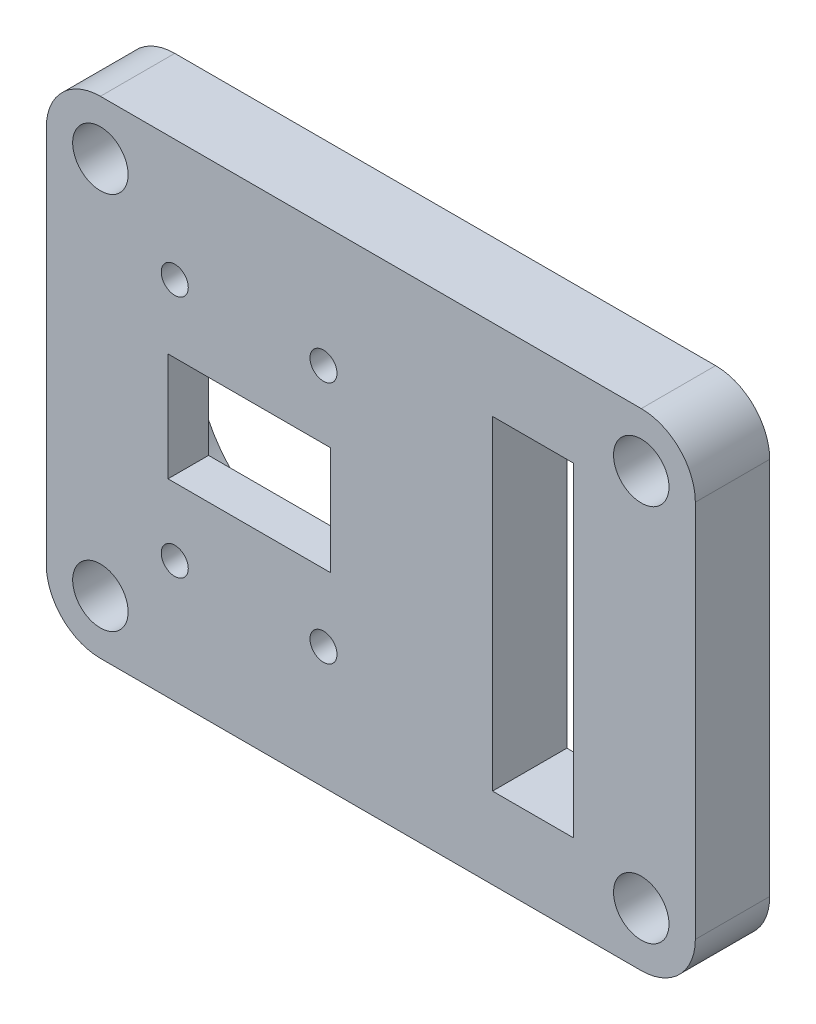
ISO-10303-21;
HEADER;
FILE_DESCRIPTION(('STEP AP214'),'2;1');
FILE_NAME('part.step','',(''),(''),'','','');
FILE_SCHEMA(('AUTOMOTIVE_DESIGN { 1 0 10303 214 1 1 1 1 }'));
ENDSEC;
DATA;
#1=APPLICATION_CONTEXT('core data for automotive mechanical design processes');
#2=APPLICATION_PROTOCOL_DEFINITION('international standard','automotive_design',2000,#1);
#3=PRODUCT_CONTEXT('',#1,'mechanical');
#4=PRODUCT('Part','Part','',(#3));
#5=PRODUCT_RELATED_PRODUCT_CATEGORY('part','',(#4));
#6=PRODUCT_DEFINITION_FORMATION('','',#4);
#7=PRODUCT_DEFINITION_CONTEXT('part definition',#1,'design');
#8=PRODUCT_DEFINITION('design','',#6,#7);
#9=PRODUCT_DEFINITION_SHAPE('','',#8);
#10=(LENGTH_UNIT() NAMED_UNIT(*) SI_UNIT(.MILLI.,.METRE.));
#11=(NAMED_UNIT(*) PLANE_ANGLE_UNIT() SI_UNIT($,.RADIAN.));
#12=(NAMED_UNIT(*) SI_UNIT($,.STERADIAN.) SOLID_ANGLE_UNIT());
#13=UNCERTAINTY_MEASURE_WITH_UNIT(LENGTH_MEASURE(1.E-05),#10,'distance_accuracy_value','');
#14=(GEOMETRIC_REPRESENTATION_CONTEXT(3) GLOBAL_UNCERTAINTY_ASSIGNED_CONTEXT((#13)) GLOBAL_UNIT_ASSIGNED_CONTEXT((#10,
#11,#12)) REPRESENTATION_CONTEXT('',''));
#15=CARTESIAN_POINT('',(0.,0.,0.));
#16=DIRECTION('',(0.,0.,1.));
#17=DIRECTION('',(1.,0.,0.));
#18=AXIS2_PLACEMENT_3D('',#15,#16,#17);
#19=CARTESIAN_POINT('',(-20.,-14.,-2.75));
#20=DIRECTION('',(0.,0.,1.));
#21=DIRECTION('',(1.,0.,0.));
#22=AXIS2_PLACEMENT_3D('',#19,#20,#21);
#23=PLANE('',#22);
#24=DIRECTION('',(1.,0.,0.));
#25=VECTOR('',#24,1.);
#26=CARTESIAN_POINT('',(9.00000000000694,-12.,-2.75));
#27=LINE('',#26,#25);
#28=CARTESIAN_POINT('',(9.00000000000694,-12.,-2.75));
#29=VERTEX_POINT('',#28);
#30=CARTESIAN_POINT('',(15.0000000000069,-12.,-2.75));
#31=VERTEX_POINT('',#30);
#32=EDGE_CURVE('E154',#29,#31,#27,.T.);
#33=ORIENTED_EDGE('',*,*,#32,.T.);
#34=DIRECTION('',(0.,1.,0.));
#35=VECTOR('',#34,1.);
#36=CARTESIAN_POINT('',(15.0000000000069,-12.,-2.75));
#37=LINE('',#36,#35);
#38=CARTESIAN_POINT('',(15.0000000000069,12.,-2.75));
#39=VERTEX_POINT('',#38);
#40=EDGE_CURVE('E148',#31,#39,#37,.T.);
#41=ORIENTED_EDGE('',*,*,#40,.T.);
#42=DIRECTION('',(-1.,0.,0.));
#43=VECTOR('',#42,1.);
#44=CARTESIAN_POINT('',(9.00000000000694,12.,-2.75));
#45=LINE('',#44,#43);
#46=CARTESIAN_POINT('',(9.00000000000694,12.,-2.75));
#47=VERTEX_POINT('',#46);
#48=EDGE_CURVE('E157',#39,#47,#45,.T.);
#49=ORIENTED_EDGE('',*,*,#48,.T.);
#50=DIRECTION('',(0.,-1.,0.));
#51=VECTOR('',#50,1.);
#52=CARTESIAN_POINT('',(9.00000000000694,-12.,-2.75));
#53=LINE('',#52,#51);
#54=EDGE_CURVE('E48',#47,#29,#53,.T.);
#55=ORIENTED_EDGE('',*,*,#54,.T.);
#56=EDGE_LOOP('',(#33,#41,#49,#55));
#57=FACE_BOUND('',#56,.T.);
#58=CARTESIAN_POINT('',(-14.499999999993,-9.,-2.75));
#59=DIRECTION('',(0.,0.,1.));
#60=DIRECTION('',(1.,0.,0.));
#61=AXIS2_PLACEMENT_3D('',#58,#59,#60);
#62=CIRCLE('',#61,1.);
#63=CARTESIAN_POINT('',(-13.499999999993,-9.,-2.75));
#64=VERTEX_POINT('',#63);
#65=EDGE_CURVE('E182',#64,#64,#62,.T.);
#66=ORIENTED_EDGE('',*,*,#65,.T.);
#67=EDGE_LOOP('',(#66));
#68=FACE_BOUND('',#67,.T.);
#69=CARTESIAN_POINT('',(-3.49999999999302,-9.,-2.75));
#70=DIRECTION('',(0.,0.,1.));
#71=DIRECTION('',(1.,0.,0.));
#72=AXIS2_PLACEMENT_3D('',#69,#70,#71);
#73=CIRCLE('',#72,1.);
#74=CARTESIAN_POINT('',(-2.49999999999302,-9.,-2.75));
#75=VERTEX_POINT('',#74);
#76=EDGE_CURVE('E188',#75,#75,#73,.T.);
#77=ORIENTED_EDGE('',*,*,#76,.T.);
#78=EDGE_LOOP('',(#77));
#79=FACE_BOUND('',#78,.T.);
#80=CARTESIAN_POINT('',(-3.49999999999302,9.,-2.75));
#81=DIRECTION('',(0.,0.,1.));
#82=DIRECTION('',(1.,0.,0.));
#83=AXIS2_PLACEMENT_3D('',#80,#81,#82);
#84=CIRCLE('',#83,1.);
#85=CARTESIAN_POINT('',(-2.49999999999302,9.,-2.75));
#86=VERTEX_POINT('',#85);
#87=EDGE_CURVE('E194',#86,#86,#84,.T.);
#88=ORIENTED_EDGE('',*,*,#87,.T.);
#89=EDGE_LOOP('',(#88));
#90=FACE_BOUND('',#89,.T.);
#91=CARTESIAN_POINT('',(-14.499999999993,9.,-2.75));
#92=DIRECTION('',(0.,0.,1.));
#93=DIRECTION('',(1.,0.,0.));
#94=AXIS2_PLACEMENT_3D('',#91,#92,#93);
#95=CIRCLE('',#94,1.);
#96=CARTESIAN_POINT('',(-13.499999999993,9.,-2.75));
#97=VERTEX_POINT('',#96);
#98=EDGE_CURVE('E200',#97,#97,#95,.T.);
#99=ORIENTED_EDGE('',*,*,#98,.T.);
#100=EDGE_LOOP('',(#99));
#101=FACE_BOUND('',#100,.T.);
#102=CARTESIAN_POINT('',(20.,-14.,-2.75));
#103=DIRECTION('',(0.,0.,1.));
#104=DIRECTION('',(1.,0.,0.));
#105=AXIS2_PLACEMENT_3D('',#102,#103,#104);
#106=CIRCLE('',#105,2.05);
#107=CARTESIAN_POINT('',(22.05,-14.,-2.75));
#108=VERTEX_POINT('',#107);
#109=EDGE_CURVE('E241',#108,#108,#106,.T.);
#110=ORIENTED_EDGE('',*,*,#109,.T.);
#111=EDGE_LOOP('',(#110));
#112=FACE_BOUND('',#111,.T.);
#113=CARTESIAN_POINT('',(-20.,14.,-2.75));
#114=DIRECTION('',(0.,0.,1.));
#115=DIRECTION('',(1.,0.,0.));
#116=AXIS2_PLACEMENT_3D('',#113,#114,#115);
#117=CIRCLE('',#116,2.05);
#118=CARTESIAN_POINT('',(-17.95,14.,-2.75));
#119=VERTEX_POINT('',#118);
#120=EDGE_CURVE('E253',#119,#119,#117,.T.);
#121=ORIENTED_EDGE('',*,*,#120,.T.);
#122=EDGE_LOOP('',(#121));
#123=FACE_BOUND('',#122,.T.);
#124=CARTESIAN_POINT('',(-20.,-14.,-2.75));
#125=DIRECTION('',(0.,0.,1.));
#126=DIRECTION('',(1.,0.,0.));
#127=AXIS2_PLACEMENT_3D('',#124,#125,#126);
#128=CIRCLE('',#127,4.);
#129=CARTESIAN_POINT('',(-24.,-14.,-2.75));
#130=VERTEX_POINT('',#129);
#131=CARTESIAN_POINT('',(-20.,-18.,-2.75));
#132=VERTEX_POINT('',#131);
#133=EDGE_CURVE('E265',#130,#132,#128,.T.);
#134=ORIENTED_EDGE('',*,*,#133,.F.);
#135=DIRECTION('',(0.,-1.,0.));
#136=VECTOR('',#135,1.);
#137=CARTESIAN_POINT('',(-24.,-14.,-2.75));
#138=LINE('',#137,#136);
#139=CARTESIAN_POINT('',(-24.,14.,-2.75));
#140=VERTEX_POINT('',#139);
#141=EDGE_CURVE('E272',#140,#130,#138,.T.);
#142=ORIENTED_EDGE('',*,*,#141,.F.);
#143=CARTESIAN_POINT('',(-20.,14.,-2.75));
#144=DIRECTION('',(0.,0.,1.));
#145=DIRECTION('',(1.,0.,0.));
#146=AXIS2_PLACEMENT_3D('',#143,#144,#145);
#147=CIRCLE('',#146,4.);
#148=CARTESIAN_POINT('',(-20.,18.,-2.75));
#149=VERTEX_POINT('',#148);
#150=EDGE_CURVE('E299',#149,#140,#147,.T.);
#151=ORIENTED_EDGE('',*,*,#150,.F.);
#152=DIRECTION('',(-1.,0.,0.));
#153=VECTOR('',#152,1.);
#154=CARTESIAN_POINT('',(-20.,18.,-2.75));
#155=LINE('',#154,#153);
#156=CARTESIAN_POINT('',(20.,18.,-2.75));
#157=VERTEX_POINT('',#156);
#158=EDGE_CURVE('E297',#157,#149,#155,.T.);
#159=ORIENTED_EDGE('',*,*,#158,.F.);
#160=CARTESIAN_POINT('',(20.,14.,-2.75));
#161=DIRECTION('',(0.,0.,1.));
#162=DIRECTION('',(1.,0.,0.));
#163=AXIS2_PLACEMENT_3D('',#160,#161,#162);
#164=CIRCLE('',#163,4.);
#165=CARTESIAN_POINT('',(24.,14.,-2.75));
#166=VERTEX_POINT('',#165);
#167=EDGE_CURVE('E295',#166,#157,#164,.T.);
#168=ORIENTED_EDGE('',*,*,#167,.F.);
#169=DIRECTION('',(0.,1.,0.));
#170=VECTOR('',#169,1.);
#171=CARTESIAN_POINT('',(24.,-14.,-2.75));
#172=LINE('',#171,#170);
#173=CARTESIAN_POINT('',(24.,-14.,-2.75));
#174=VERTEX_POINT('',#173);
#175=EDGE_CURVE('E293',#174,#166,#172,.T.);
#176=ORIENTED_EDGE('',*,*,#175,.F.);
#177=CARTESIAN_POINT('',(20.,-14.,-2.75));
#178=DIRECTION('',(0.,0.,1.));
#179=DIRECTION('',(1.,0.,0.));
#180=AXIS2_PLACEMENT_3D('',#177,#178,#179);
#181=CIRCLE('',#180,4.);
#182=CARTESIAN_POINT('',(20.,-18.,-2.75));
#183=VERTEX_POINT('',#182);
#184=EDGE_CURVE('E291',#183,#174,#181,.T.);
#185=ORIENTED_EDGE('',*,*,#184,.F.);
#186=DIRECTION('',(1.,0.,0.));
#187=VECTOR('',#186,1.);
#188=CARTESIAN_POINT('',(-20.,-18.,-2.75));
#189=LINE('',#188,#187);
#190=EDGE_CURVE('E289',#132,#183,#189,.T.);
#191=ORIENTED_EDGE('',*,*,#190,.F.);
#192=EDGE_LOOP('',(#134,#142,#151,#159,#168,#176,#185,#191));
#193=FACE_BOUND('',#192,.T.);
#194=CARTESIAN_POINT('',(-20.,-14.,-2.75));
#195=DIRECTION('',(0.,0.,1.));
#196=DIRECTION('',(1.,0.,0.));
#197=AXIS2_PLACEMENT_3D('',#194,#195,#196);
#198=CIRCLE('',#197,2.05);
#199=CARTESIAN_POINT('',(-17.95,-14.,-2.75));
#200=VERTEX_POINT('',#199);
#201=EDGE_CURVE('E259',#200,#200,#198,.T.);
#202=ORIENTED_EDGE('',*,*,#201,.T.);
#203=EDGE_LOOP('',(#202));
#204=FACE_BOUND('',#203,.T.);
#205=CARTESIAN_POINT('',(20.,14.,-2.75));
#206=DIRECTION('',(0.,0.,1.));
#207=DIRECTION('',(1.,0.,0.));
#208=AXIS2_PLACEMENT_3D('',#205,#206,#207);
#209=CIRCLE('',#208,2.05);
#210=CARTESIAN_POINT('',(22.05,14.,-2.75));
#211=VERTEX_POINT('',#210);
#212=EDGE_CURVE('E247',#211,#211,#209,.T.);
#213=ORIENTED_EDGE('',*,*,#212,.T.);
#214=EDGE_LOOP('',(#213));
#215=FACE_BOUND('',#214,.T.);
#216=CARTESIAN_POINT('',(-8.99999999999306,0.,-2.75));
#217=DIRECTION('',(0.,0.,1.));
#218=DIRECTION('',(1.,0.,0.));
#219=AXIS2_PLACEMENT_3D('',#216,#217,#218);
#220=CIRCLE('',#219,9.5);
#221=CARTESIAN_POINT('',(0.500000000006936,0.,-2.75));
#222=VERTEX_POINT('',#221);
#223=EDGE_CURVE('E231',#222,#222,#220,.T.);
#224=ORIENTED_EDGE('',*,*,#223,.T.);
#225=EDGE_LOOP('',(#224));
#226=FACE_BOUND('',#225,.T.);
#227=ADVANCED_FACE('F33',(#57,#68,#79,#90,#101,#112,#123,#193,#204,#215,#226),#23,.F.);
#228=CARTESIAN_POINT('',(-20.,-14.,2.75));
#229=DIRECTION('',(0.,0.,1.));
#230=DIRECTION('',(1.,0.,0.));
#231=AXIS2_PLACEMENT_3D('',#228,#229,#230);
#232=PLANE('',#231);
#233=DIRECTION('',(0.,1.,0.));
#234=VECTOR('',#233,1.);
#235=CARTESIAN_POINT('',(15.0000000000069,-12.,2.75));
#236=LINE('',#235,#234);
#237=CARTESIAN_POINT('',(15.0000000000069,-12.,2.75));
#238=VERTEX_POINT('',#237);
#239=CARTESIAN_POINT('',(15.0000000000069,12.,2.75));
#240=VERTEX_POINT('',#239);
#241=EDGE_CURVE('E56',#238,#240,#236,.T.);
#242=ORIENTED_EDGE('',*,*,#241,.F.);
#243=DIRECTION('',(1.,0.,0.));
#244=VECTOR('',#243,1.);
#245=CARTESIAN_POINT('',(9.00000000000694,-12.,2.75));
#246=LINE('',#245,#244);
#247=CARTESIAN_POINT('',(9.00000000000694,-12.,2.75));
#248=VERTEX_POINT('',#247);
#249=EDGE_CURVE('E163',#248,#238,#246,.T.);
#250=ORIENTED_EDGE('',*,*,#249,.F.);
#251=DIRECTION('',(0.,-1.,0.));
#252=VECTOR('',#251,1.);
#253=CARTESIAN_POINT('',(9.00000000000694,-12.,2.75));
#254=LINE('',#253,#252);
#255=CARTESIAN_POINT('',(9.00000000000694,12.,2.75));
#256=VERTEX_POINT('',#255);
#257=EDGE_CURVE('E166',#256,#248,#254,.T.);
#258=ORIENTED_EDGE('',*,*,#257,.F.);
#259=DIRECTION('',(-1.,0.,0.));
#260=VECTOR('',#259,1.);
#261=CARTESIAN_POINT('',(9.00000000000694,12.,2.75));
#262=LINE('',#261,#260);
#263=EDGE_CURVE('E172',#240,#256,#262,.T.);
#264=ORIENTED_EDGE('',*,*,#263,.F.);
#265=EDGE_LOOP('',(#242,#250,#258,#264));
#266=FACE_BOUND('',#265,.T.);
#267=CARTESIAN_POINT('',(-14.499999999993,-9.,2.75));
#268=DIRECTION('',(0.,0.,1.));
#269=DIRECTION('',(1.,0.,0.));
#270=AXIS2_PLACEMENT_3D('',#267,#268,#269);
#271=CIRCLE('',#270,1.);
#272=CARTESIAN_POINT('',(-13.499999999993,-9.,2.75));
#273=VERTEX_POINT('',#272);
#274=EDGE_CURVE('E178',#273,#273,#271,.T.);
#275=ORIENTED_EDGE('',*,*,#274,.F.);
#276=EDGE_LOOP('',(#275));
#277=FACE_BOUND('',#276,.T.);
#278=CARTESIAN_POINT('',(-3.49999999999302,-9.,2.75));
#279=DIRECTION('',(0.,0.,1.));
#280=DIRECTION('',(1.,0.,0.));
#281=AXIS2_PLACEMENT_3D('',#278,#279,#280);
#282=CIRCLE('',#281,1.);
#283=CARTESIAN_POINT('',(-2.49999999999302,-9.,2.75));
#284=VERTEX_POINT('',#283);
#285=EDGE_CURVE('E185',#284,#284,#282,.T.);
#286=ORIENTED_EDGE('',*,*,#285,.F.);
#287=EDGE_LOOP('',(#286));
#288=FACE_BOUND('',#287,.T.);
#289=CARTESIAN_POINT('',(-3.49999999999302,9.,2.75));
#290=DIRECTION('',(0.,0.,1.));
#291=DIRECTION('',(1.,0.,0.));
#292=AXIS2_PLACEMENT_3D('',#289,#290,#291);
#293=CIRCLE('',#292,1.);
#294=CARTESIAN_POINT('',(-2.49999999999302,9.,2.75));
#295=VERTEX_POINT('',#294);
#296=EDGE_CURVE('E191',#295,#295,#293,.T.);
#297=ORIENTED_EDGE('',*,*,#296,.F.);
#298=EDGE_LOOP('',(#297));
#299=FACE_BOUND('',#298,.T.);
#300=CARTESIAN_POINT('',(-14.499999999993,9.,2.75));
#301=DIRECTION('',(0.,0.,1.));
#302=DIRECTION('',(1.,0.,0.));
#303=AXIS2_PLACEMENT_3D('',#300,#301,#302);
#304=CIRCLE('',#303,1.);
#305=CARTESIAN_POINT('',(-13.499999999993,9.,2.75));
#306=VERTEX_POINT('',#305);
#307=EDGE_CURVE('E197',#306,#306,#304,.T.);
#308=ORIENTED_EDGE('',*,*,#307,.F.);
#309=EDGE_LOOP('',(#308));
#310=FACE_BOUND('',#309,.T.);
#311=DIRECTION('',(0.,-1.,0.));
#312=VECTOR('',#311,1.);
#313=CARTESIAN_POINT('',(-2.99999999999307,4.,2.75));
#314=LINE('',#313,#312);
#315=CARTESIAN_POINT('',(-2.99999999999307,4.,2.75));
#316=VERTEX_POINT('',#315);
#317=CARTESIAN_POINT('',(-2.99999999999307,-4.,2.75));
#318=VERTEX_POINT('',#317);
#319=EDGE_CURVE('E206',#316,#318,#314,.T.);
#320=ORIENTED_EDGE('',*,*,#319,.T.);
#321=DIRECTION('',(-1.,0.,0.));
#322=VECTOR('',#321,1.);
#323=CARTESIAN_POINT('',(-14.9999999999931,-4.,2.75));
#324=LINE('',#323,#322);
#325=CARTESIAN_POINT('',(-14.9999999999931,-4.,2.75));
#326=VERTEX_POINT('',#325);
#327=EDGE_CURVE('E209',#318,#326,#324,.T.);
#328=ORIENTED_EDGE('',*,*,#327,.T.);
#329=DIRECTION('',(0.,1.,0.));
#330=VECTOR('',#329,1.);
#331=CARTESIAN_POINT('',(-14.9999999999931,4.,2.75));
#332=LINE('',#331,#330);
#333=CARTESIAN_POINT('',(-14.9999999999931,4.,2.75));
#334=VERTEX_POINT('',#333);
#335=EDGE_CURVE('E213',#326,#334,#332,.T.);
#336=ORIENTED_EDGE('',*,*,#335,.T.);
#337=DIRECTION('',(1.,0.,0.));
#338=VECTOR('',#337,1.);
#339=CARTESIAN_POINT('',(-14.9999999999931,4.,2.75));
#340=LINE('',#339,#338);
#341=EDGE_CURVE('E216',#334,#316,#340,.T.);
#342=ORIENTED_EDGE('',*,*,#341,.T.);
#343=EDGE_LOOP('',(#320,#328,#336,#342));
#344=FACE_BOUND('',#343,.T.);
#345=CARTESIAN_POINT('',(20.,14.,2.75));
#346=DIRECTION('',(0.,0.,1.));
#347=DIRECTION('',(1.,0.,0.));
#348=AXIS2_PLACEMENT_3D('',#345,#346,#347);
#349=CIRCLE('',#348,2.05);
#350=CARTESIAN_POINT('',(22.05,14.,2.75));
#351=VERTEX_POINT('',#350);
#352=EDGE_CURVE('E250',#351,#351,#349,.T.);
#353=ORIENTED_EDGE('',*,*,#352,.F.);
#354=EDGE_LOOP('',(#353));
#355=FACE_BOUND('',#354,.T.);
#356=CARTESIAN_POINT('',(-20.,-14.,2.75));
#357=DIRECTION('',(0.,0.,1.));
#358=DIRECTION('',(1.,0.,0.));
#359=AXIS2_PLACEMENT_3D('',#356,#357,#358);
#360=CIRCLE('',#359,2.05);
#361=CARTESIAN_POINT('',(-17.95,-14.,2.75));
#362=VERTEX_POINT('',#361);
#363=EDGE_CURVE('E262',#362,#362,#360,.T.);
#364=ORIENTED_EDGE('',*,*,#363,.F.);
#365=EDGE_LOOP('',(#364));
#366=FACE_BOUND('',#365,.T.);
#367=CARTESIAN_POINT('',(-20.,-14.,2.75));
#368=DIRECTION('',(0.,0.,1.));
#369=DIRECTION('',(1.,0.,0.));
#370=AXIS2_PLACEMENT_3D('',#367,#368,#369);
#371=CIRCLE('',#370,4.);
#372=CARTESIAN_POINT('',(-24.,-14.,2.75));
#373=VERTEX_POINT('',#372);
#374=CARTESIAN_POINT('',(-20.,-18.,2.75));
#375=VERTEX_POINT('',#374);
#376=EDGE_CURVE('E268',#373,#375,#371,.T.);
#377=ORIENTED_EDGE('',*,*,#376,.T.);
#378=DIRECTION('',(1.,0.,0.));
#379=VECTOR('',#378,1.);
#380=CARTESIAN_POINT('',(-20.,-18.,2.75));
#381=LINE('',#380,#379);
#382=CARTESIAN_POINT('',(20.,-18.,2.75));
#383=VERTEX_POINT('',#382);
#384=EDGE_CURVE('E271',#375,#383,#381,.T.);
#385=ORIENTED_EDGE('',*,*,#384,.T.);
#386=CARTESIAN_POINT('',(20.,-14.,2.75));
#387=DIRECTION('',(0.,0.,1.));
#388=DIRECTION('',(1.,0.,0.));
#389=AXIS2_PLACEMENT_3D('',#386,#387,#388);
#390=CIRCLE('',#389,4.);
#391=CARTESIAN_POINT('',(24.,-14.,2.75));
#392=VERTEX_POINT('',#391);
#393=EDGE_CURVE('E274',#383,#392,#390,.T.);
#394=ORIENTED_EDGE('',*,*,#393,.T.);
#395=DIRECTION('',(0.,1.,0.));
#396=VECTOR('',#395,1.);
#397=CARTESIAN_POINT('',(24.,-14.,2.75));
#398=LINE('',#397,#396);
#399=CARTESIAN_POINT('',(24.,14.,2.75));
#400=VERTEX_POINT('',#399);
#401=EDGE_CURVE('E276',#392,#400,#398,.T.);
#402=ORIENTED_EDGE('',*,*,#401,.T.);
#403=CARTESIAN_POINT('',(20.,14.,2.75));
#404=DIRECTION('',(0.,0.,1.));
#405=DIRECTION('',(1.,0.,0.));
#406=AXIS2_PLACEMENT_3D('',#403,#404,#405);
#407=CIRCLE('',#406,4.);
#408=CARTESIAN_POINT('',(20.,18.,2.75));
#409=VERTEX_POINT('',#408);
#410=EDGE_CURVE('E278',#400,#409,#407,.T.);
#411=ORIENTED_EDGE('',*,*,#410,.T.);
#412=DIRECTION('',(-1.,0.,0.));
#413=VECTOR('',#412,1.);
#414=CARTESIAN_POINT('',(-20.,18.,2.75));
#415=LINE('',#414,#413);
#416=CARTESIAN_POINT('',(-20.,18.,2.75));
#417=VERTEX_POINT('',#416);
#418=EDGE_CURVE('E280',#409,#417,#415,.T.);
#419=ORIENTED_EDGE('',*,*,#418,.T.);
#420=CARTESIAN_POINT('',(-20.,14.,2.75));
#421=DIRECTION('',(0.,0.,1.));
#422=DIRECTION('',(1.,0.,0.));
#423=AXIS2_PLACEMENT_3D('',#420,#421,#422);
#424=CIRCLE('',#423,4.);
#425=CARTESIAN_POINT('',(-24.,14.,2.75));
#426=VERTEX_POINT('',#425);
#427=EDGE_CURVE('E282',#417,#426,#424,.T.);
#428=ORIENTED_EDGE('',*,*,#427,.T.);
#429=DIRECTION('',(0.,-1.,0.));
#430=VECTOR('',#429,1.);
#431=CARTESIAN_POINT('',(-24.,-14.,2.75));
#432=LINE('',#431,#430);
#433=EDGE_CURVE('E284',#426,#373,#432,.T.);
#434=ORIENTED_EDGE('',*,*,#433,.T.);
#435=EDGE_LOOP('',(#377,#385,#394,#402,#411,#419,#428,#434));
#436=FACE_BOUND('',#435,.T.);
#437=CARTESIAN_POINT('',(-20.,14.,2.75));
#438=DIRECTION('',(0.,0.,1.));
#439=DIRECTION('',(1.,0.,0.));
#440=AXIS2_PLACEMENT_3D('',#437,#438,#439);
#441=CIRCLE('',#440,2.05);
#442=CARTESIAN_POINT('',(-17.95,14.,2.75));
#443=VERTEX_POINT('',#442);
#444=EDGE_CURVE('E256',#443,#443,#441,.T.);
#445=ORIENTED_EDGE('',*,*,#444,.F.);
#446=EDGE_LOOP('',(#445));
#447=FACE_BOUND('',#446,.T.);
#448=CARTESIAN_POINT('',(20.,-14.,2.75));
#449=DIRECTION('',(0.,0.,1.));
#450=DIRECTION('',(1.,0.,0.));
#451=AXIS2_PLACEMENT_3D('',#448,#449,#450);
#452=CIRCLE('',#451,2.05);
#453=CARTESIAN_POINT('',(22.05,-14.,2.75));
#454=VERTEX_POINT('',#453);
#455=EDGE_CURVE('E244',#454,#454,#452,.T.);
#456=ORIENTED_EDGE('',*,*,#455,.F.);
#457=EDGE_LOOP('',(#456));
#458=FACE_BOUND('',#457,.T.);
#459=ADVANCED_FACE('F342',(#266,#277,#288,#299,#310,#344,#355,#366,#436,#447,#458),#232,.T.);
#460=CARTESIAN_POINT('',(-20.,-14.,2.75));
#461=DIRECTION('',(0.,0.,-1.));
#462=DIRECTION('',(-1.,0.,0.));
#463=AXIS2_PLACEMENT_3D('',#460,#461,#462);
#464=CYLINDRICAL_SURFACE('',#463,4.);
#465=ORIENTED_EDGE('',*,*,#133,.T.);
#466=DIRECTION('',(0.,0.,-1.));
#467=VECTOR('',#466,1.);
#468=CARTESIAN_POINT('',(-20.,-18.,2.75));
#469=LINE('',#468,#467);
#470=EDGE_CURVE('E11',#375,#132,#469,.T.);
#471=ORIENTED_EDGE('',*,*,#470,.F.);
#472=ORIENTED_EDGE('',*,*,#376,.F.);
#473=DIRECTION('',(0.,0.,-1.));
#474=VECTOR('',#473,1.);
#475=CARTESIAN_POINT('',(-24.,-14.,2.75));
#476=LINE('',#475,#474);
#477=EDGE_CURVE('E286',#373,#130,#476,.T.);
#478=ORIENTED_EDGE('',*,*,#477,.T.);
#479=EDGE_LOOP('',(#465,#471,#472,#478));
#480=FACE_BOUND('',#479,.T.);
#481=ADVANCED_FACE('F35',(#480),#464,.T.);
#482=CARTESIAN_POINT('',(-20.,-18.,2.75));
#483=DIRECTION('',(0.,1.,0.));
#484=DIRECTION('',(0.,0.,1.));
#485=AXIS2_PLACEMENT_3D('',#482,#483,#484);
#486=PLANE('',#485);
#487=ORIENTED_EDGE('',*,*,#190,.T.);
#488=DIRECTION('',(0.,0.,-1.));
#489=VECTOR('',#488,1.);
#490=CARTESIAN_POINT('',(20.,-18.,2.75));
#491=LINE('',#490,#489);
#492=EDGE_CURVE('E41',#383,#183,#491,.T.);
#493=ORIENTED_EDGE('',*,*,#492,.F.);
#494=ORIENTED_EDGE('',*,*,#384,.F.);
#495=ORIENTED_EDGE('',*,*,#470,.T.);
#496=EDGE_LOOP('',(#487,#493,#494,#495));
#497=FACE_BOUND('',#496,.T.);
#498=ADVANCED_FACE('F347',(#497),#486,.F.);
#499=CARTESIAN_POINT('',(20.,-14.,2.75));
#500=DIRECTION('',(0.,0.,-1.));
#501=DIRECTION('',(-1.,0.,0.));
#502=AXIS2_PLACEMENT_3D('',#499,#500,#501);
#503=CYLINDRICAL_SURFACE('',#502,4.);
#504=ORIENTED_EDGE('',*,*,#184,.T.);
#505=DIRECTION('',(0.,0.,-1.));
#506=VECTOR('',#505,1.);
#507=CARTESIAN_POINT('',(24.,-14.,2.75));
#508=LINE('',#507,#506);
#509=EDGE_CURVE('E316',#392,#174,#508,.T.);
#510=ORIENTED_EDGE('',*,*,#509,.F.);
#511=ORIENTED_EDGE('',*,*,#393,.F.);
#512=ORIENTED_EDGE('',*,*,#492,.T.);
#513=EDGE_LOOP('',(#504,#510,#511,#512));
#514=FACE_BOUND('',#513,.T.);
#515=ADVANCED_FACE('F323',(#514),#503,.T.);
#516=CARTESIAN_POINT('',(24.,-14.,2.75));
#517=DIRECTION('',(-1.,0.,0.));
#518=DIRECTION('',(0.,0.,1.));
#519=AXIS2_PLACEMENT_3D('',#516,#517,#518);
#520=PLANE('',#519);
#521=ORIENTED_EDGE('',*,*,#175,.T.);
#522=DIRECTION('',(0.,0.,-1.));
#523=VECTOR('',#522,1.);
#524=CARTESIAN_POINT('',(24.,14.,2.75));
#525=LINE('',#524,#523);
#526=EDGE_CURVE('E313',#400,#166,#525,.T.);
#527=ORIENTED_EDGE('',*,*,#526,.F.);
#528=ORIENTED_EDGE('',*,*,#401,.F.);
#529=ORIENTED_EDGE('',*,*,#509,.T.);
#530=EDGE_LOOP('',(#521,#527,#528,#529));
#531=FACE_BOUND('',#530,.T.);
#532=ADVANCED_FACE('F334',(#531),#520,.F.);
#533=CARTESIAN_POINT('',(20.,14.,2.75));
#534=DIRECTION('',(0.,0.,-1.));
#535=DIRECTION('',(-1.,0.,0.));
#536=AXIS2_PLACEMENT_3D('',#533,#534,#535);
#537=CYLINDRICAL_SURFACE('',#536,4.);
#538=ORIENTED_EDGE('',*,*,#167,.T.);
#539=DIRECTION('',(0.,0.,-1.));
#540=VECTOR('',#539,1.);
#541=CARTESIAN_POINT('',(20.,18.,2.75));
#542=LINE('',#541,#540);
#543=EDGE_CURVE('E310',#409,#157,#542,.T.);
#544=ORIENTED_EDGE('',*,*,#543,.F.);
#545=ORIENTED_EDGE('',*,*,#410,.F.);
#546=ORIENTED_EDGE('',*,*,#526,.T.);
#547=EDGE_LOOP('',(#538,#544,#545,#546));
#548=FACE_BOUND('',#547,.T.);
#549=ADVANCED_FACE('F338',(#548),#537,.T.);
#550=CARTESIAN_POINT('',(-20.,18.,2.75));
#551=DIRECTION('',(0.,-1.,0.));
#552=DIRECTION('',(0.,0.,-1.));
#553=AXIS2_PLACEMENT_3D('',#550,#551,#552);
#554=PLANE('',#553);
#555=ORIENTED_EDGE('',*,*,#158,.T.);
#556=DIRECTION('',(0.,0.,-1.));
#557=VECTOR('',#556,1.);
#558=CARTESIAN_POINT('',(-20.,18.,2.75));
#559=LINE('',#558,#557);
#560=EDGE_CURVE('E307',#417,#149,#559,.T.);
#561=ORIENTED_EDGE('',*,*,#560,.F.);
#562=ORIENTED_EDGE('',*,*,#418,.F.);
#563=ORIENTED_EDGE('',*,*,#543,.T.);
#564=EDGE_LOOP('',(#555,#561,#562,#563));
#565=FACE_BOUND('',#564,.T.);
#566=ADVANCED_FACE('F360',(#565),#554,.F.);
#567=CARTESIAN_POINT('',(-20.,14.,2.75));
#568=DIRECTION('',(0.,0.,-1.));
#569=DIRECTION('',(-1.,0.,0.));
#570=AXIS2_PLACEMENT_3D('',#567,#568,#569);
#571=CYLINDRICAL_SURFACE('',#570,4.);
#572=ORIENTED_EDGE('',*,*,#150,.T.);
#573=DIRECTION('',(0.,0.,-1.));
#574=VECTOR('',#573,1.);
#575=CARTESIAN_POINT('',(-24.,14.,2.75));
#576=LINE('',#575,#574);
#577=EDGE_CURVE('E304',#426,#140,#576,.T.);
#578=ORIENTED_EDGE('',*,*,#577,.F.);
#579=ORIENTED_EDGE('',*,*,#427,.F.);
#580=ORIENTED_EDGE('',*,*,#560,.T.);
#581=EDGE_LOOP('',(#572,#578,#579,#580));
#582=FACE_BOUND('',#581,.T.);
#583=ADVANCED_FACE('F358',(#582),#571,.T.);
#584=CARTESIAN_POINT('',(-24.,-14.,2.75));
#585=DIRECTION('',(1.,0.,0.));
#586=DIRECTION('',(0.,0.,-1.));
#587=AXIS2_PLACEMENT_3D('',#584,#585,#586);
#588=PLANE('',#587);
#589=ORIENTED_EDGE('',*,*,#141,.T.);
#590=ORIENTED_EDGE('',*,*,#477,.F.);
#591=ORIENTED_EDGE('',*,*,#433,.F.);
#592=ORIENTED_EDGE('',*,*,#577,.T.);
#593=EDGE_LOOP('',(#589,#590,#591,#592));
#594=FACE_BOUND('',#593,.T.);
#595=ADVANCED_FACE('F353',(#594),#588,.F.);
#596=CARTESIAN_POINT('',(-20.,-14.,2.75));
#597=DIRECTION('',(0.,0.,-1.));
#598=DIRECTION('',(-1.,0.,0.));
#599=AXIS2_PLACEMENT_3D('',#596,#597,#598);
#600=CYLINDRICAL_SURFACE('',#599,2.05);
#601=ORIENTED_EDGE('',*,*,#363,.T.);
#602=EDGE_LOOP('',(#601));
#603=FACE_BOUND('',#602,.T.);
#604=ORIENTED_EDGE('',*,*,#201,.F.);
#605=EDGE_LOOP('',(#604));
#606=FACE_BOUND('',#605,.T.);
#607=ADVANCED_FACE('F380',(#603,#606),#600,.F.);
#608=CARTESIAN_POINT('',(-20.,14.,2.75));
#609=DIRECTION('',(0.,0.,-1.));
#610=DIRECTION('',(-1.,0.,0.));
#611=AXIS2_PLACEMENT_3D('',#608,#609,#610);
#612=CYLINDRICAL_SURFACE('',#611,2.05);
#613=ORIENTED_EDGE('',*,*,#444,.T.);
#614=EDGE_LOOP('',(#613));
#615=FACE_BOUND('',#614,.T.);
#616=ORIENTED_EDGE('',*,*,#120,.F.);
#617=EDGE_LOOP('',(#616));
#618=FACE_BOUND('',#617,.T.);
#619=ADVANCED_FACE('F384',(#615,#618),#612,.F.);
#620=CARTESIAN_POINT('',(20.,14.,2.75));
#621=DIRECTION('',(0.,0.,-1.));
#622=DIRECTION('',(-1.,0.,0.));
#623=AXIS2_PLACEMENT_3D('',#620,#621,#622);
#624=CYLINDRICAL_SURFACE('',#623,2.05);
#625=ORIENTED_EDGE('',*,*,#352,.T.);
#626=EDGE_LOOP('',(#625));
#627=FACE_BOUND('',#626,.T.);
#628=ORIENTED_EDGE('',*,*,#212,.F.);
#629=EDGE_LOOP('',(#628));
#630=FACE_BOUND('',#629,.T.);
#631=ADVANCED_FACE('F389',(#627,#630),#624,.F.);
#632=CARTESIAN_POINT('',(20.,-14.,2.75));
#633=DIRECTION('',(0.,0.,-1.));
#634=DIRECTION('',(-1.,0.,0.));
#635=AXIS2_PLACEMENT_3D('',#632,#633,#634);
#636=CYLINDRICAL_SURFACE('',#635,2.05);
#637=ORIENTED_EDGE('',*,*,#455,.T.);
#638=EDGE_LOOP('',(#637));
#639=FACE_BOUND('',#638,.T.);
#640=ORIENTED_EDGE('',*,*,#109,.F.);
#641=EDGE_LOOP('',(#640));
#642=FACE_BOUND('',#641,.T.);
#643=ADVANCED_FACE('F396',(#639,#642),#636,.F.);
#644=CARTESIAN_POINT('',(-8.99999999999306,0.,-0.25));
#645=DIRECTION('',(0.,0.,-1.));
#646=DIRECTION('',(-1.,0.,0.));
#647=AXIS2_PLACEMENT_3D('',#644,#645,#646);
#648=CYLINDRICAL_SURFACE('',#647,9.5);
#649=CARTESIAN_POINT('',(-8.99999999999306,0.,-0.25));
#650=DIRECTION('',(0.,0.,1.));
#651=DIRECTION('',(1.,0.,0.));
#652=AXIS2_PLACEMENT_3D('',#649,#650,#651);
#653=CIRCLE('',#652,9.5);
#654=CARTESIAN_POINT('',(0.500000000006936,0.,-0.25));
#655=VERTEX_POINT('',#654);
#656=EDGE_CURVE('E238',#655,#655,#653,.T.);
#657=ORIENTED_EDGE('',*,*,#656,.T.);
#658=EDGE_LOOP('',(#657));
#659=FACE_BOUND('',#658,.T.);
#660=ORIENTED_EDGE('',*,*,#223,.F.);
#661=EDGE_LOOP('',(#660));
#662=FACE_BOUND('',#661,.T.);
#663=ADVANCED_FACE('F400',(#659,#662),#648,.F.);
#664=CARTESIAN_POINT('',(-8.99999999999306,0.,-0.25));
#665=DIRECTION('',(0.,0.,1.));
#666=DIRECTION('',(1.,0.,0.));
#667=AXIS2_PLACEMENT_3D('',#664,#665,#666);
#668=PLANE('',#667);
#669=DIRECTION('',(-1.,0.,0.));
#670=VECTOR('',#669,1.);
#671=CARTESIAN_POINT('',(-14.9999999999931,-4.,-0.25));
#672=LINE('',#671,#670);
#673=CARTESIAN_POINT('',(-2.99999999999307,-4.,-0.25));
#674=VERTEX_POINT('',#673);
#675=CARTESIAN_POINT('',(-14.9999999999931,-4.,-0.25));
#676=VERTEX_POINT('',#675);
#677=EDGE_CURVE('E221',#674,#676,#672,.T.);
#678=ORIENTED_EDGE('',*,*,#677,.F.);
#679=DIRECTION('',(0.,-1.,0.));
#680=VECTOR('',#679,1.);
#681=CARTESIAN_POINT('',(-2.99999999999307,4.,-0.25));
#682=LINE('',#681,#680);
#683=CARTESIAN_POINT('',(-2.99999999999307,4.,-0.25));
#684=VERTEX_POINT('',#683);
#685=EDGE_CURVE('E203',#684,#674,#682,.T.);
#686=ORIENTED_EDGE('',*,*,#685,.F.);
#687=DIRECTION('',(1.,0.,0.));
#688=VECTOR('',#687,1.);
#689=CARTESIAN_POINT('',(-14.9999999999931,4.,-0.25));
#690=LINE('',#689,#688);
#691=CARTESIAN_POINT('',(-14.9999999999931,4.,-0.25));
#692=VERTEX_POINT('',#691);
#693=EDGE_CURVE('E210',#692,#684,#690,.T.);
#694=ORIENTED_EDGE('',*,*,#693,.F.);
#695=DIRECTION('',(0.,1.,0.));
#696=VECTOR('',#695,1.);
#697=CARTESIAN_POINT('',(-14.9999999999931,4.,-0.25));
#698=LINE('',#697,#696);
#699=EDGE_CURVE('E224',#676,#692,#698,.T.);
#700=ORIENTED_EDGE('',*,*,#699,.F.);
#701=EDGE_LOOP('',(#678,#686,#694,#700));
#702=FACE_BOUND('',#701,.T.);
#703=ORIENTED_EDGE('',*,*,#656,.F.);
#704=EDGE_LOOP('',(#703));
#705=FACE_BOUND('',#704,.T.);
#706=ADVANCED_FACE('F404',(#702,#705),#668,.F.);
#707=CARTESIAN_POINT('',(-2.99999999999307,4.,2.75));
#708=DIRECTION('',(1.,0.,0.));
#709=DIRECTION('',(0.,0.,-1.));
#710=AXIS2_PLACEMENT_3D('',#707,#708,#709);
#711=PLANE('',#710);
#712=ORIENTED_EDGE('',*,*,#685,.T.);
#713=DIRECTION('',(0.,0.,-1.));
#714=VECTOR('',#713,1.);
#715=CARTESIAN_POINT('',(-2.99999999999307,-4.,2.75));
#716=LINE('',#715,#714);
#717=EDGE_CURVE('E219',#318,#674,#716,.T.);
#718=ORIENTED_EDGE('',*,*,#717,.F.);
#719=ORIENTED_EDGE('',*,*,#319,.F.);
#720=DIRECTION('',(0.,0.,-1.));
#721=VECTOR('',#720,1.);
#722=CARTESIAN_POINT('',(-2.99999999999307,4.,2.75));
#723=LINE('',#722,#721);
#724=EDGE_CURVE('E229',#316,#684,#723,.T.);
#725=ORIENTED_EDGE('',*,*,#724,.T.);
#726=EDGE_LOOP('',(#712,#718,#719,#725));
#727=FACE_BOUND('',#726,.T.);
#728=ADVANCED_FACE('F408',(#727),#711,.F.);
#729=CARTESIAN_POINT('',(-14.9999999999931,4.,2.75));
#730=DIRECTION('',(0.,1.,0.));
#731=DIRECTION('',(0.,0.,1.));
#732=AXIS2_PLACEMENT_3D('',#729,#730,#731);
#733=PLANE('',#732);
#734=ORIENTED_EDGE('',*,*,#693,.T.);
#735=ORIENTED_EDGE('',*,*,#724,.F.);
#736=ORIENTED_EDGE('',*,*,#341,.F.);
#737=DIRECTION('',(0.,0.,-1.));
#738=VECTOR('',#737,1.);
#739=CARTESIAN_POINT('',(-14.9999999999931,4.,2.75));
#740=LINE('',#739,#738);
#741=EDGE_CURVE('E232',#334,#692,#740,.T.);
#742=ORIENTED_EDGE('',*,*,#741,.T.);
#743=EDGE_LOOP('',(#734,#735,#736,#742));
#744=FACE_BOUND('',#743,.T.);
#745=ADVANCED_FACE('F412',(#744),#733,.F.);
#746=CARTESIAN_POINT('',(-14.9999999999931,4.,2.75));
#747=DIRECTION('',(-1.,0.,0.));
#748=DIRECTION('',(0.,0.,1.));
#749=AXIS2_PLACEMENT_3D('',#746,#747,#748);
#750=PLANE('',#749);
#751=ORIENTED_EDGE('',*,*,#699,.T.);
#752=ORIENTED_EDGE('',*,*,#741,.F.);
#753=ORIENTED_EDGE('',*,*,#335,.F.);
#754=DIRECTION('',(0.,0.,-1.));
#755=VECTOR('',#754,1.);
#756=CARTESIAN_POINT('',(-14.9999999999931,-4.,2.75));
#757=LINE('',#756,#755);
#758=EDGE_CURVE('E234',#326,#676,#757,.T.);
#759=ORIENTED_EDGE('',*,*,#758,.T.);
#760=EDGE_LOOP('',(#751,#752,#753,#759));
#761=FACE_BOUND('',#760,.T.);
#762=ADVANCED_FACE('F418',(#761),#750,.F.);
#763=CARTESIAN_POINT('',(-14.9999999999931,-4.,2.75));
#764=DIRECTION('',(0.,-1.,0.));
#765=DIRECTION('',(0.,0.,-1.));
#766=AXIS2_PLACEMENT_3D('',#763,#764,#765);
#767=PLANE('',#766);
#768=ORIENTED_EDGE('',*,*,#677,.T.);
#769=ORIENTED_EDGE('',*,*,#758,.F.);
#770=ORIENTED_EDGE('',*,*,#327,.F.);
#771=ORIENTED_EDGE('',*,*,#717,.T.);
#772=EDGE_LOOP('',(#768,#769,#770,#771));
#773=FACE_BOUND('',#772,.T.);
#774=ADVANCED_FACE('F414',(#773),#767,.F.);
#775=CARTESIAN_POINT('',(-14.499999999993,9.,-2.75));
#776=DIRECTION('',(0.,0.,1.));
#777=DIRECTION('',(1.,0.,0.));
#778=AXIS2_PLACEMENT_3D('',#775,#776,#777);
#779=CYLINDRICAL_SURFACE('',#778,1.);
#780=ORIENTED_EDGE('',*,*,#98,.F.);
#781=EDGE_LOOP('',(#780));
#782=FACE_BOUND('',#781,.T.);
#783=ORIENTED_EDGE('',*,*,#307,.T.);
#784=EDGE_LOOP('',(#783));
#785=FACE_BOUND('',#784,.T.);
#786=ADVANCED_FACE('F417',(#782,#785),#779,.F.);
#787=CARTESIAN_POINT('',(-3.49999999999302,9.,-2.75));
#788=DIRECTION('',(0.,0.,1.));
#789=DIRECTION('',(1.,0.,0.));
#790=AXIS2_PLACEMENT_3D('',#787,#788,#789);
#791=CYLINDRICAL_SURFACE('',#790,1.);
#792=ORIENTED_EDGE('',*,*,#87,.F.);
#793=EDGE_LOOP('',(#792));
#794=FACE_BOUND('',#793,.T.);
#795=ORIENTED_EDGE('',*,*,#296,.T.);
#796=EDGE_LOOP('',(#795));
#797=FACE_BOUND('',#796,.T.);
#798=ADVANCED_FACE('F428',(#794,#797),#791,.F.);
#799=CARTESIAN_POINT('',(-3.49999999999302,-9.,-2.75));
#800=DIRECTION('',(0.,0.,1.));
#801=DIRECTION('',(1.,0.,0.));
#802=AXIS2_PLACEMENT_3D('',#799,#800,#801);
#803=CYLINDRICAL_SURFACE('',#802,1.);
#804=ORIENTED_EDGE('',*,*,#76,.F.);
#805=EDGE_LOOP('',(#804));
#806=FACE_BOUND('',#805,.T.);
#807=ORIENTED_EDGE('',*,*,#285,.T.);
#808=EDGE_LOOP('',(#807));
#809=FACE_BOUND('',#808,.T.);
#810=ADVANCED_FACE('F432',(#806,#809),#803,.F.);
#811=CARTESIAN_POINT('',(-14.499999999993,-9.,-2.75));
#812=DIRECTION('',(0.,0.,1.));
#813=DIRECTION('',(1.,0.,0.));
#814=AXIS2_PLACEMENT_3D('',#811,#812,#813);
#815=CYLINDRICAL_SURFACE('',#814,1.);
#816=ORIENTED_EDGE('',*,*,#65,.F.);
#817=EDGE_LOOP('',(#816));
#818=FACE_BOUND('',#817,.T.);
#819=ORIENTED_EDGE('',*,*,#274,.T.);
#820=EDGE_LOOP('',(#819));
#821=FACE_BOUND('',#820,.T.);
#822=ADVANCED_FACE('F436',(#818,#821),#815,.F.);
#823=CARTESIAN_POINT('',(15.0000000000069,-12.,-2.75));
#824=DIRECTION('',(1.,0.,0.));
#825=DIRECTION('',(0.,0.,-1.));
#826=AXIS2_PLACEMENT_3D('',#823,#824,#825);
#827=PLANE('',#826);
#828=ORIENTED_EDGE('',*,*,#241,.T.);
#829=DIRECTION('',(0.,0.,1.));
#830=VECTOR('',#829,1.);
#831=CARTESIAN_POINT('',(15.0000000000069,12.,-2.75));
#832=LINE('',#831,#830);
#833=EDGE_CURVE('E144',#39,#240,#832,.T.);
#834=ORIENTED_EDGE('',*,*,#833,.F.);
#835=ORIENTED_EDGE('',*,*,#40,.F.);
#836=DIRECTION('',(0.,0.,1.));
#837=VECTOR('',#836,1.);
#838=CARTESIAN_POINT('',(15.0000000000069,-12.,-2.75));
#839=LINE('',#838,#837);
#840=EDGE_CURVE('E176',#31,#238,#839,.T.);
#841=ORIENTED_EDGE('',*,*,#840,.T.);
#842=EDGE_LOOP('',(#828,#834,#835,#841));
#843=FACE_BOUND('',#842,.T.);
#844=ADVANCED_FACE('F146',(#843),#827,.F.);
#845=CARTESIAN_POINT('',(9.00000000000694,-12.,-2.75));
#846=DIRECTION('',(0.,-1.,0.));
#847=DIRECTION('',(0.,0.,-1.));
#848=AXIS2_PLACEMENT_3D('',#845,#846,#847);
#849=PLANE('',#848);
#850=ORIENTED_EDGE('',*,*,#249,.T.);
#851=ORIENTED_EDGE('',*,*,#840,.F.);
#852=ORIENTED_EDGE('',*,*,#32,.F.);
#853=DIRECTION('',(0.,0.,1.));
#854=VECTOR('',#853,1.);
#855=CARTESIAN_POINT('',(9.00000000000694,-12.,-2.75));
#856=LINE('',#855,#854);
#857=EDGE_CURVE('E179',#29,#248,#856,.T.);
#858=ORIENTED_EDGE('',*,*,#857,.T.);
#859=EDGE_LOOP('',(#850,#851,#852,#858));
#860=FACE_BOUND('',#859,.T.);
#861=ADVANCED_FACE('F443',(#860),#849,.F.);
#862=CARTESIAN_POINT('',(9.00000000000694,-12.,-2.75));
#863=DIRECTION('',(-1.,0.,0.));
#864=DIRECTION('',(0.,0.,1.));
#865=AXIS2_PLACEMENT_3D('',#862,#863,#864);
#866=PLANE('',#865);
#867=ORIENTED_EDGE('',*,*,#257,.T.);
#868=ORIENTED_EDGE('',*,*,#857,.F.);
#869=ORIENTED_EDGE('',*,*,#54,.F.);
#870=DIRECTION('',(0.,0.,1.));
#871=VECTOR('',#870,1.);
#872=CARTESIAN_POINT('',(9.00000000000694,12.,-2.75));
#873=LINE('',#872,#871);
#874=EDGE_CURVE('E153',#47,#256,#873,.T.);
#875=ORIENTED_EDGE('',*,*,#874,.T.);
#876=EDGE_LOOP('',(#867,#868,#869,#875));
#877=FACE_BOUND('',#876,.T.);
#878=ADVANCED_FACE('F446',(#877),#866,.F.);
#879=CARTESIAN_POINT('',(9.00000000000694,12.,-2.75));
#880=DIRECTION('',(0.,1.,0.));
#881=DIRECTION('',(0.,0.,1.));
#882=AXIS2_PLACEMENT_3D('',#879,#880,#881);
#883=PLANE('',#882);
#884=ORIENTED_EDGE('',*,*,#263,.T.);
#885=ORIENTED_EDGE('',*,*,#874,.F.);
#886=ORIENTED_EDGE('',*,*,#48,.F.);
#887=ORIENTED_EDGE('',*,*,#833,.T.);
#888=EDGE_LOOP('',(#884,#885,#886,#887));
#889=FACE_BOUND('',#888,.T.);
#890=ADVANCED_FACE('F158',(#889),#883,.F.);
#891=CLOSED_SHELL('',(#227,#459,#481,#498,#515,#532,#549,#566,#583,#595,#607,#619,#631,#643,
#663,#706,#728,#745,#762,#774,#786,#798,#810,#822,#844,#861,#878,#890));
#892=MANIFOLD_SOLID_BREP('B2',#891);
#893=ADVANCED_BREP_SHAPE_REPRESENTATION('',(#18,#892),#14);
#894=SHAPE_DEFINITION_REPRESENTATION(#9,#893);
ENDSEC;
END-ISO-10303-21;
